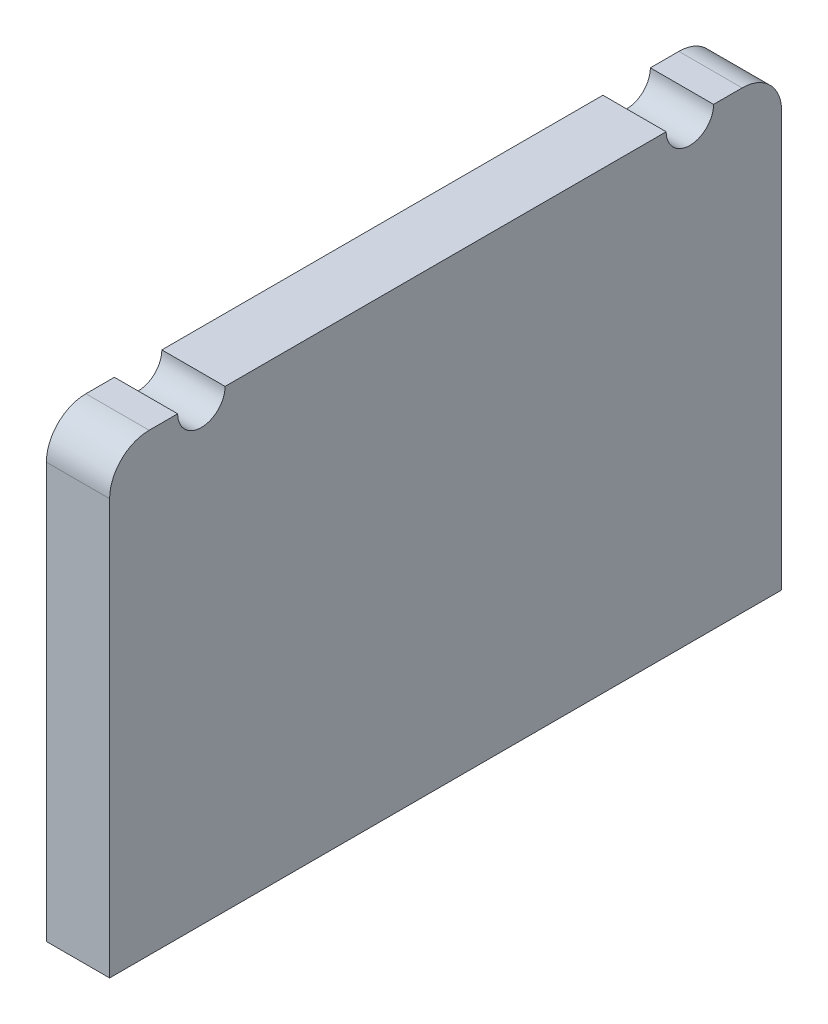
ISO-10303-21;
HEADER;
FILE_DESCRIPTION(('STEP AP214'),'2;1');
FILE_NAME('part.step','',(''),(''),'','','');
FILE_SCHEMA(('AUTOMOTIVE_DESIGN { 1 0 10303 214 1 1 1 1 }'));
ENDSEC;
DATA;
#1=APPLICATION_CONTEXT('core data for automotive mechanical design processes');
#2=APPLICATION_PROTOCOL_DEFINITION('international standard','automotive_design',2000,#1);
#3=PRODUCT_CONTEXT('',#1,'mechanical');
#4=PRODUCT('Part','Part','',(#3));
#5=PRODUCT_RELATED_PRODUCT_CATEGORY('part','',(#4));
#6=PRODUCT_DEFINITION_FORMATION('','',#4);
#7=PRODUCT_DEFINITION_CONTEXT('part definition',#1,'design');
#8=PRODUCT_DEFINITION('design','',#6,#7);
#9=PRODUCT_DEFINITION_SHAPE('','',#8);
#10=(LENGTH_UNIT() NAMED_UNIT(*) SI_UNIT(.MILLI.,.METRE.));
#11=(NAMED_UNIT(*) PLANE_ANGLE_UNIT() SI_UNIT($,.RADIAN.));
#12=(NAMED_UNIT(*) SI_UNIT($,.STERADIAN.) SOLID_ANGLE_UNIT());
#13=UNCERTAINTY_MEASURE_WITH_UNIT(LENGTH_MEASURE(1.E-05),#10,'distance_accuracy_value','');
#14=(GEOMETRIC_REPRESENTATION_CONTEXT(3) GLOBAL_UNCERTAINTY_ASSIGNED_CONTEXT((#13)) GLOBAL_UNIT_ASSIGNED_CONTEXT((#10,
#11,#12)) REPRESENTATION_CONTEXT('',''));
#15=CARTESIAN_POINT('',(0.,0.,0.));
#16=DIRECTION('',(0.,0.,1.));
#17=DIRECTION('',(1.,0.,0.));
#18=AXIS2_PLACEMENT_3D('',#15,#16,#17);
#19=CARTESIAN_POINT('',(10.16,-36.5125,53.975));
#20=DIRECTION('',(0.,0.,-1.));
#21=DIRECTION('',(-1.,0.,0.));
#22=AXIS2_PLACEMENT_3D('',#19,#20,#21);
#23=PLANE('',#22);
#24=DIRECTION('',(0.,-1.,0.));
#25=VECTOR('',#24,1.);
#26=CARTESIAN_POINT('',(0.,-36.5125,53.975));
#27=LINE('',#26,#25);
#28=CARTESIAN_POINT('',(0.,30.1625,53.975));
#29=VERTEX_POINT('',#28);
#30=CARTESIAN_POINT('',(0.,-36.5125,53.975));
#31=VERTEX_POINT('',#30);
#32=EDGE_CURVE('E141',#29,#31,#27,.T.);
#33=ORIENTED_EDGE('',*,*,#32,.T.);
#34=DIRECTION('',(-1.,0.,0.));
#35=VECTOR('',#34,1.);
#36=CARTESIAN_POINT('',(10.16,-36.5125,53.975));
#37=LINE('',#36,#35);
#38=CARTESIAN_POINT('',(10.16,-36.5125,53.975));
#39=VERTEX_POINT('',#38);
#40=EDGE_CURVE('E11',#39,#31,#37,.T.);
#41=ORIENTED_EDGE('',*,*,#40,.F.);
#42=DIRECTION('',(0.,-1.,0.));
#43=VECTOR('',#42,1.);
#44=CARTESIAN_POINT('',(10.16,-36.5125,53.975));
#45=LINE('',#44,#43);
#46=CARTESIAN_POINT('',(10.16,30.1625,53.975));
#47=VERTEX_POINT('',#46);
#48=EDGE_CURVE('E159',#47,#39,#45,.T.);
#49=ORIENTED_EDGE('',*,*,#48,.F.);
#50=DIRECTION('',(-1.,0.,0.));
#51=VECTOR('',#50,1.);
#52=CARTESIAN_POINT('',(10.16,30.1625,53.975));
#53=LINE('',#52,#51);
#54=EDGE_CURVE('E137',#47,#29,#53,.T.);
#55=ORIENTED_EDGE('',*,*,#54,.T.);
#56=EDGE_LOOP('',(#33,#41,#49,#55));
#57=FACE_BOUND('',#56,.T.);
#58=ADVANCED_FACE('F33',(#57),#23,.F.);
#59=CARTESIAN_POINT('',(10.16,-36.5125,53.975));
#60=DIRECTION('',(0.,1.,0.));
#61=DIRECTION('',(0.,0.,1.));
#62=AXIS2_PLACEMENT_3D('',#59,#60,#61);
#63=PLANE('',#62);
#64=DIRECTION('',(0.,0.,-1.));
#65=VECTOR('',#64,1.);
#66=CARTESIAN_POINT('',(0.,-36.5125,53.975));
#67=LINE('',#66,#65);
#68=CARTESIAN_POINT('',(0.,-36.5125,-53.975));
#69=VERTEX_POINT('',#68);
#70=EDGE_CURVE('E144',#31,#69,#67,.T.);
#71=ORIENTED_EDGE('',*,*,#70,.T.);
#72=DIRECTION('',(-1.,0.,0.));
#73=VECTOR('',#72,1.);
#74=CARTESIAN_POINT('',(10.16,-36.5125,-53.975));
#75=LINE('',#74,#73);
#76=CARTESIAN_POINT('',(10.16,-36.5125,-53.975));
#77=VERTEX_POINT('',#76);
#78=EDGE_CURVE('E41',#77,#69,#75,.T.);
#79=ORIENTED_EDGE('',*,*,#78,.F.);
#80=DIRECTION('',(0.,0.,-1.));
#81=VECTOR('',#80,1.);
#82=CARTESIAN_POINT('',(10.16,-36.5125,53.975));
#83=LINE('',#82,#81);
#84=EDGE_CURVE('E98',#39,#77,#83,.T.);
#85=ORIENTED_EDGE('',*,*,#84,.F.);
#86=ORIENTED_EDGE('',*,*,#40,.T.);
#87=EDGE_LOOP('',(#71,#79,#85,#86));
#88=FACE_BOUND('',#87,.T.);
#89=ADVANCED_FACE('F208',(#88),#63,.F.);
#90=CARTESIAN_POINT('',(10.16,-36.5125,-53.975));
#91=DIRECTION('',(0.,0.,1.));
#92=DIRECTION('',(1.,0.,0.));
#93=AXIS2_PLACEMENT_3D('',#90,#91,#92);
#94=PLANE('',#93);
#95=DIRECTION('',(0.,1.,0.));
#96=VECTOR('',#95,1.);
#97=CARTESIAN_POINT('',(0.,-36.5125,-53.975));
#98=LINE('',#97,#96);
#99=CARTESIAN_POINT('',(0.,30.1625,-53.975));
#100=VERTEX_POINT('',#99);
#101=EDGE_CURVE('E146',#69,#100,#98,.T.);
#102=ORIENTED_EDGE('',*,*,#101,.T.);
#103=DIRECTION('',(-1.,0.,0.));
#104=VECTOR('',#103,1.);
#105=CARTESIAN_POINT('',(10.16,30.1625,-53.975));
#106=LINE('',#105,#104);
#107=CARTESIAN_POINT('',(10.16,30.1625,-53.975));
#108=VERTEX_POINT('',#107);
#109=EDGE_CURVE('E172',#108,#100,#106,.T.);
#110=ORIENTED_EDGE('',*,*,#109,.F.);
#111=DIRECTION('',(0.,1.,0.));
#112=VECTOR('',#111,1.);
#113=CARTESIAN_POINT('',(10.16,-36.5125,-53.975));
#114=LINE('',#113,#112);
#115=EDGE_CURVE('E180',#77,#108,#114,.T.);
#116=ORIENTED_EDGE('',*,*,#115,.F.);
#117=ORIENTED_EDGE('',*,*,#78,.T.);
#118=EDGE_LOOP('',(#102,#110,#116,#117));
#119=FACE_BOUND('',#118,.T.);
#120=ADVANCED_FACE('F178',(#119),#94,.F.);
#121=CARTESIAN_POINT('',(10.16,30.1625,-47.625));
#122=DIRECTION('',(-1.,0.,0.));
#123=DIRECTION('',(0.,0.,1.));
#124=AXIS2_PLACEMENT_3D('',#121,#122,#123);
#125=CYLINDRICAL_SURFACE('',#124,6.35);
#126=CARTESIAN_POINT('',(0.,30.1625,-47.625));
#127=DIRECTION('',(1.,0.,0.));
#128=DIRECTION('',(0.,0.,1.));
#129=AXIS2_PLACEMENT_3D('',#126,#127,#128);
#130=CIRCLE('',#129,6.35);
#131=CARTESIAN_POINT('',(0.,36.5125,-47.6249999999999));
#132=VERTEX_POINT('',#131);
#133=EDGE_CURVE('E148',#100,#132,#130,.T.);
#134=ORIENTED_EDGE('',*,*,#133,.T.);
#135=DIRECTION('',(-1.,0.,0.));
#136=VECTOR('',#135,1.);
#137=CARTESIAN_POINT('',(10.16,36.5125,-47.6249999999999));
#138=LINE('',#137,#136);
#139=CARTESIAN_POINT('',(10.16,36.5125,-47.6249999999999));
#140=VERTEX_POINT('',#139);
#141=EDGE_CURVE('E169',#140,#132,#138,.T.);
#142=ORIENTED_EDGE('',*,*,#141,.F.);
#143=CARTESIAN_POINT('',(10.16,30.1625,-47.625));
#144=DIRECTION('',(1.,0.,0.));
#145=DIRECTION('',(0.,0.,1.));
#146=AXIS2_PLACEMENT_3D('',#143,#144,#145);
#147=CIRCLE('',#146,6.35);
#148=EDGE_CURVE('E198',#108,#140,#147,.T.);
#149=ORIENTED_EDGE('',*,*,#148,.F.);
#150=ORIENTED_EDGE('',*,*,#109,.T.);
#151=EDGE_LOOP('',(#134,#142,#149,#150));
#152=FACE_BOUND('',#151,.T.);
#153=ADVANCED_FACE('F189',(#152),#125,.T.);
#154=CARTESIAN_POINT('',(10.16,36.5125,-43.045928132));
#155=DIRECTION('',(0.,-1.,0.));
#156=DIRECTION('',(0.,0.,-1.));
#157=AXIS2_PLACEMENT_3D('',#154,#155,#156);
#158=PLANE('',#157);
#159=DIRECTION('',(0.,0.,1.));
#160=VECTOR('',#159,1.);
#161=CARTESIAN_POINT('',(0.,36.5125,-43.045928132));
#162=LINE('',#161,#160);
#163=CARTESIAN_POINT('',(0.,36.5125,-43.045928132));
#164=VERTEX_POINT('',#163);
#165=EDGE_CURVE('E150',#132,#164,#162,.T.);
#166=ORIENTED_EDGE('',*,*,#165,.T.);
#167=DIRECTION('',(-1.,0.,0.));
#168=VECTOR('',#167,1.);
#169=CARTESIAN_POINT('',(10.16,36.5125,-43.045928132));
#170=LINE('',#169,#168);
#171=CARTESIAN_POINT('',(10.16,36.5125,-43.045928132));
#172=VERTEX_POINT('',#171);
#173=EDGE_CURVE('E166',#172,#164,#170,.T.);
#174=ORIENTED_EDGE('',*,*,#173,.F.);
#175=DIRECTION('',(0.,0.,1.));
#176=VECTOR('',#175,1.);
#177=CARTESIAN_POINT('',(10.16,36.5125,-43.045928132));
#178=LINE('',#177,#176);
#179=EDGE_CURVE('E195',#140,#172,#178,.T.);
#180=ORIENTED_EDGE('',*,*,#179,.F.);
#181=ORIENTED_EDGE('',*,*,#141,.T.);
#182=EDGE_LOOP('',(#166,#174,#180,#181));
#183=FACE_BOUND('',#182,.T.);
#184=ADVANCED_FACE('F193',(#183),#158,.F.);
#185=CARTESIAN_POINT('',(10.16,36.5125,-39.235928132));
#186=DIRECTION('',(-1.,0.,0.));
#187=DIRECTION('',(0.,0.,1.));
#188=AXIS2_PLACEMENT_3D('',#185,#186,#187);
#189=CYLINDRICAL_SURFACE('',#188,3.81);
#190=CARTESIAN_POINT('',(0.,36.5125,-39.235928132));
#191=DIRECTION('',(-1.,0.,0.));
#192=DIRECTION('',(0.,0.,-1.));
#193=AXIS2_PLACEMENT_3D('',#190,#191,#192);
#194=CIRCLE('',#193,3.81);
#195=CARTESIAN_POINT('',(0.,36.5125,-35.425928132));
#196=VERTEX_POINT('',#195);
#197=EDGE_CURVE('E152',#164,#196,#194,.T.);
#198=ORIENTED_EDGE('',*,*,#197,.T.);
#199=DIRECTION('',(-1.,0.,0.));
#200=VECTOR('',#199,1.);
#201=CARTESIAN_POINT('',(10.16,36.5125,-35.425928132));
#202=LINE('',#201,#200);
#203=CARTESIAN_POINT('',(10.16,36.5125,-35.425928132));
#204=VERTEX_POINT('',#203);
#205=EDGE_CURVE('E163',#204,#196,#202,.T.);
#206=ORIENTED_EDGE('',*,*,#205,.F.);
#207=CARTESIAN_POINT('',(10.16,36.5125,-39.235928132));
#208=DIRECTION('',(-1.,0.,0.));
#209=DIRECTION('',(0.,0.,-1.));
#210=AXIS2_PLACEMENT_3D('',#207,#208,#209);
#211=CIRCLE('',#210,3.81);
#212=EDGE_CURVE('E197',#172,#204,#211,.T.);
#213=ORIENTED_EDGE('',*,*,#212,.F.);
#214=ORIENTED_EDGE('',*,*,#173,.T.);
#215=EDGE_LOOP('',(#198,#206,#213,#214));
#216=FACE_BOUND('',#215,.T.);
#217=ADVANCED_FACE('F220',(#216),#189,.F.);
#218=CARTESIAN_POINT('',(10.16,36.5125,35.425928132));
#219=DIRECTION('',(0.,-1.,0.));
#220=DIRECTION('',(0.,0.,-1.));
#221=AXIS2_PLACEMENT_3D('',#218,#219,#220);
#222=PLANE('',#221);
#223=DIRECTION('',(0.,0.,1.));
#224=VECTOR('',#223,1.);
#225=CARTESIAN_POINT('',(0.,36.5125,35.425928132));
#226=LINE('',#225,#224);
#227=CARTESIAN_POINT('',(0.,36.5125,35.425928132));
#228=VERTEX_POINT('',#227);
#229=EDGE_CURVE('E154',#196,#228,#226,.T.);
#230=ORIENTED_EDGE('',*,*,#229,.T.);
#231=DIRECTION('',(-1.,0.,0.));
#232=VECTOR('',#231,1.);
#233=CARTESIAN_POINT('',(10.16,36.5125,35.425928132));
#234=LINE('',#233,#232);
#235=CARTESIAN_POINT('',(10.16,36.5125,35.425928132));
#236=VERTEX_POINT('',#235);
#237=EDGE_CURVE('E132',#236,#228,#234,.T.);
#238=ORIENTED_EDGE('',*,*,#237,.F.);
#239=DIRECTION('',(0.,0.,1.));
#240=VECTOR('',#239,1.);
#241=CARTESIAN_POINT('',(10.16,36.5125,35.425928132));
#242=LINE('',#241,#240);
#243=EDGE_CURVE('E123',#204,#236,#242,.T.);
#244=ORIENTED_EDGE('',*,*,#243,.F.);
#245=ORIENTED_EDGE('',*,*,#205,.T.);
#246=EDGE_LOOP('',(#230,#238,#244,#245));
#247=FACE_BOUND('',#246,.T.);
#248=ADVANCED_FACE('F223',(#247),#222,.F.);
#249=CARTESIAN_POINT('',(10.16,36.5125,39.235928132));
#250=DIRECTION('',(-1.,0.,0.));
#251=DIRECTION('',(0.,0.,1.));
#252=AXIS2_PLACEMENT_3D('',#249,#250,#251);
#253=CYLINDRICAL_SURFACE('',#252,3.81);
#254=CARTESIAN_POINT('',(0.,36.5125,39.235928132));
#255=DIRECTION('',(-1.,0.,0.));
#256=DIRECTION('',(0.,0.,-1.));
#257=AXIS2_PLACEMENT_3D('',#254,#255,#256);
#258=CIRCLE('',#257,3.81);
#259=CARTESIAN_POINT('',(0.,36.5125,43.045928132));
#260=VERTEX_POINT('',#259);
#261=EDGE_CURVE('E131',#228,#260,#258,.T.);
#262=ORIENTED_EDGE('',*,*,#261,.T.);
#263=DIRECTION('',(-1.,0.,0.));
#264=VECTOR('',#263,1.);
#265=CARTESIAN_POINT('',(10.16,36.5125,43.045928132));
#266=LINE('',#265,#264);
#267=CARTESIAN_POINT('',(10.16,36.5125,43.045928132));
#268=VERTEX_POINT('',#267);
#269=EDGE_CURVE('E128',#268,#260,#266,.T.);
#270=ORIENTED_EDGE('',*,*,#269,.F.);
#271=CARTESIAN_POINT('',(10.16,36.5125,39.235928132));
#272=DIRECTION('',(-1.,0.,0.));
#273=DIRECTION('',(0.,0.,-1.));
#274=AXIS2_PLACEMENT_3D('',#271,#272,#273);
#275=CIRCLE('',#274,3.81);
#276=EDGE_CURVE('E117',#236,#268,#275,.T.);
#277=ORIENTED_EDGE('',*,*,#276,.F.);
#278=ORIENTED_EDGE('',*,*,#237,.T.);
#279=EDGE_LOOP('',(#262,#270,#277,#278));
#280=FACE_BOUND('',#279,.T.);
#281=ADVANCED_FACE('F129',(#280),#253,.F.);
#282=CARTESIAN_POINT('',(10.16,36.5125,47.625));
#283=DIRECTION('',(0.,-1.,0.));
#284=DIRECTION('',(0.,0.,-1.));
#285=AXIS2_PLACEMENT_3D('',#282,#283,#284);
#286=PLANE('',#285);
#287=DIRECTION('',(0.,0.,1.));
#288=VECTOR('',#287,1.);
#289=CARTESIAN_POINT('',(0.,36.5125,47.625));
#290=LINE('',#289,#288);
#291=CARTESIAN_POINT('',(0.,36.5125,47.625));
#292=VERTEX_POINT('',#291);
#293=EDGE_CURVE('E84',#260,#292,#290,.T.);
#294=ORIENTED_EDGE('',*,*,#293,.T.);
#295=DIRECTION('',(-1.,0.,0.));
#296=VECTOR('',#295,1.);
#297=CARTESIAN_POINT('',(10.16,36.5125,47.625));
#298=LINE('',#297,#296);
#299=CARTESIAN_POINT('',(10.16,36.5125,47.625));
#300=VERTEX_POINT('',#299);
#301=EDGE_CURVE('E133',#300,#292,#298,.T.);
#302=ORIENTED_EDGE('',*,*,#301,.F.);
#303=DIRECTION('',(0.,0.,1.));
#304=VECTOR('',#303,1.);
#305=CARTESIAN_POINT('',(10.16,36.5125,47.625));
#306=LINE('',#305,#304);
#307=EDGE_CURVE('E121',#268,#300,#306,.T.);
#308=ORIENTED_EDGE('',*,*,#307,.F.);
#309=ORIENTED_EDGE('',*,*,#269,.T.);
#310=EDGE_LOOP('',(#294,#302,#308,#309));
#311=FACE_BOUND('',#310,.T.);
#312=ADVANCED_FACE('F135',(#311),#286,.F.);
#313=CARTESIAN_POINT('',(10.16,30.1625,47.625));
#314=DIRECTION('',(-1.,0.,0.));
#315=DIRECTION('',(0.,0.,1.));
#316=AXIS2_PLACEMENT_3D('',#313,#314,#315);
#317=CYLINDRICAL_SURFACE('',#316,6.35);
#318=CARTESIAN_POINT('',(0.,30.1625,47.625));
#319=DIRECTION('',(1.,0.,0.));
#320=DIRECTION('',(0.,0.,1.));
#321=AXIS2_PLACEMENT_3D('',#318,#319,#320);
#322=CIRCLE('',#321,6.35);
#323=EDGE_CURVE('E90',#292,#29,#322,.T.);
#324=ORIENTED_EDGE('',*,*,#323,.T.);
#325=ORIENTED_EDGE('',*,*,#54,.F.);
#326=CARTESIAN_POINT('',(10.16,30.1625,47.625));
#327=DIRECTION('',(1.,0.,0.));
#328=DIRECTION('',(0.,0.,1.));
#329=AXIS2_PLACEMENT_3D('',#326,#327,#328);
#330=CIRCLE('',#329,6.35);
#331=EDGE_CURVE('E49',#300,#47,#330,.T.);
#332=ORIENTED_EDGE('',*,*,#331,.F.);
#333=ORIENTED_EDGE('',*,*,#301,.T.);
#334=EDGE_LOOP('',(#324,#325,#332,#333));
#335=FACE_BOUND('',#334,.T.);
#336=ADVANCED_FACE('F232',(#335),#317,.T.);
#337=CARTESIAN_POINT('',(10.16,30.1625,47.625));
#338=DIRECTION('',(-1.,0.,0.));
#339=DIRECTION('',(0.,0.,1.));
#340=AXIS2_PLACEMENT_3D('',#337,#338,#339);
#341=PLANE('',#340);
#342=ORIENTED_EDGE('',*,*,#48,.T.);
#343=ORIENTED_EDGE('',*,*,#84,.T.);
#344=ORIENTED_EDGE('',*,*,#115,.T.);
#345=ORIENTED_EDGE('',*,*,#148,.T.);
#346=ORIENTED_EDGE('',*,*,#179,.T.);
#347=ORIENTED_EDGE('',*,*,#212,.T.);
#348=ORIENTED_EDGE('',*,*,#243,.T.);
#349=ORIENTED_EDGE('',*,*,#276,.T.);
#350=ORIENTED_EDGE('',*,*,#307,.T.);
#351=ORIENTED_EDGE('',*,*,#331,.T.);
#352=EDGE_LOOP('',(#342,#343,#344,#345,#346,#347,#348,#349,#350,#351));
#353=FACE_BOUND('',#352,.T.);
#354=ADVANCED_FACE('F119',(#353),#341,.F.);
#355=CARTESIAN_POINT('',(0.,30.1625,47.625));
#356=DIRECTION('',(-1.,0.,0.));
#357=DIRECTION('',(0.,0.,1.));
#358=AXIS2_PLACEMENT_3D('',#355,#356,#357);
#359=PLANE('',#358);
#360=ORIENTED_EDGE('',*,*,#32,.F.);
#361=ORIENTED_EDGE('',*,*,#323,.F.);
#362=ORIENTED_EDGE('',*,*,#293,.F.);
#363=ORIENTED_EDGE('',*,*,#261,.F.);
#364=ORIENTED_EDGE('',*,*,#229,.F.);
#365=ORIENTED_EDGE('',*,*,#197,.F.);
#366=ORIENTED_EDGE('',*,*,#165,.F.);
#367=ORIENTED_EDGE('',*,*,#133,.F.);
#368=ORIENTED_EDGE('',*,*,#101,.F.);
#369=ORIENTED_EDGE('',*,*,#70,.F.);
#370=EDGE_LOOP('',(#360,#361,#362,#363,#364,#365,#366,#367,#368,#369));
#371=FACE_BOUND('',#370,.T.);
#372=ADVANCED_FACE('F184',(#371),#359,.T.);
#373=CLOSED_SHELL('',(#58,#89,#120,#153,#184,#217,#248,#281,#312,#336,#354,#372));
#374=MANIFOLD_SOLID_BREP('B2',#373);
#375=ADVANCED_BREP_SHAPE_REPRESENTATION('',(#18,#374),#14);
#376=SHAPE_DEFINITION_REPRESENTATION(#9,#375);
ENDSEC;
END-ISO-10303-21;
